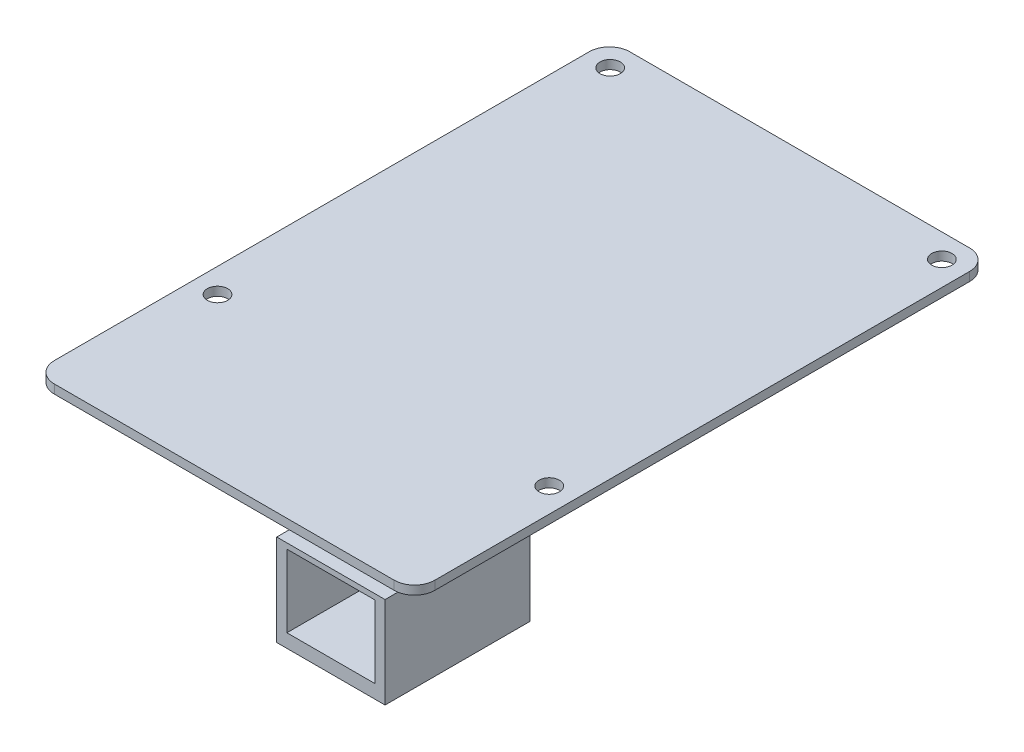
ISO-10303-21;
HEADER;
FILE_DESCRIPTION(('STEP AP214'),'2;1');
FILE_NAME('part.step','',(''),(''),'','','');
FILE_SCHEMA(('AUTOMOTIVE_DESIGN { 1 0 10303 214 1 1 1 1 }'));
ENDSEC;
DATA;
#1=APPLICATION_CONTEXT('core data for automotive mechanical design processes');
#2=APPLICATION_PROTOCOL_DEFINITION('international standard','automotive_design',2000,#1);
#3=PRODUCT_CONTEXT('',#1,'mechanical');
#4=PRODUCT('Part','Part','',(#3));
#5=PRODUCT_RELATED_PRODUCT_CATEGORY('part','',(#4));
#6=PRODUCT_DEFINITION_FORMATION('','',#4);
#7=PRODUCT_DEFINITION_CONTEXT('part definition',#1,'design');
#8=PRODUCT_DEFINITION('design','',#6,#7);
#9=PRODUCT_DEFINITION_SHAPE('','',#8);
#10=(LENGTH_UNIT() NAMED_UNIT(*) SI_UNIT(.MILLI.,.METRE.));
#11=(NAMED_UNIT(*) PLANE_ANGLE_UNIT() SI_UNIT($,.RADIAN.));
#12=(NAMED_UNIT(*) SI_UNIT($,.STERADIAN.) SOLID_ANGLE_UNIT());
#13=UNCERTAINTY_MEASURE_WITH_UNIT(LENGTH_MEASURE(1.E-05),#10,'distance_accuracy_value','');
#14=(GEOMETRIC_REPRESENTATION_CONTEXT(3) GLOBAL_UNCERTAINTY_ASSIGNED_CONTEXT((#13)) GLOBAL_UNIT_ASSIGNED_CONTEXT((#10,
#11,#12)) REPRESENTATION_CONTEXT('',''));
#15=CARTESIAN_POINT('',(0.,0.,0.));
#16=DIRECTION('',(0.,0.,1.));
#17=DIRECTION('',(1.,0.,0.));
#18=AXIS2_PLACEMENT_3D('',#15,#16,#17);
#19=CARTESIAN_POINT('',(0.,0.,0.));
#20=DIRECTION('',(0.,1.,0.));
#21=DIRECTION('',(0.,0.,1.));
#22=AXIS2_PLACEMENT_3D('',#19,#20,#21);
#23=PLANE('',#22);
#24=CARTESIAN_POINT('',(24.5,0.,19.));
#25=DIRECTION('',(0.,1.,0.));
#26=DIRECTION('',(0.,0.,1.));
#27=AXIS2_PLACEMENT_3D('',#24,#25,#26);
#28=CIRCLE('',#27,1.5);
#29=CARTESIAN_POINT('',(24.5,0.,20.5));
#30=VERTEX_POINT('',#29);
#31=EDGE_CURVE('E249',#30,#30,#28,.T.);
#32=ORIENTED_EDGE('',*,*,#31,.T.);
#33=EDGE_LOOP('',(#32));
#34=FACE_BOUND('',#33,.T.);
#35=CARTESIAN_POINT('',(24.5,0.,-39.));
#36=DIRECTION('',(0.,1.,0.));
#37=DIRECTION('',(0.,0.,1.));
#38=AXIS2_PLACEMENT_3D('',#35,#36,#37);
#39=CIRCLE('',#38,1.5);
#40=CARTESIAN_POINT('',(24.5,0.,-37.5));
#41=VERTEX_POINT('',#40);
#42=EDGE_CURVE('E307',#41,#41,#39,.T.);
#43=ORIENTED_EDGE('',*,*,#42,.T.);
#44=EDGE_LOOP('',(#43));
#45=FACE_BOUND('',#44,.T.);
#46=CARTESIAN_POINT('',(-24.5,0.,-39.));
#47=DIRECTION('',(0.,1.,0.));
#48=DIRECTION('',(0.,0.,1.));
#49=AXIS2_PLACEMENT_3D('',#46,#47,#48);
#50=CIRCLE('',#49,1.5);
#51=CARTESIAN_POINT('',(-24.5,0.,-37.5));
#52=VERTEX_POINT('',#51);
#53=EDGE_CURVE('E304',#52,#52,#50,.T.);
#54=ORIENTED_EDGE('',*,*,#53,.T.);
#55=EDGE_LOOP('',(#54));
#56=FACE_BOUND('',#55,.T.);
#57=CARTESIAN_POINT('',(-24.5,0.,19.));
#58=DIRECTION('',(0.,1.,0.));
#59=DIRECTION('',(0.,0.,1.));
#60=AXIS2_PLACEMENT_3D('',#57,#58,#59);
#61=CIRCLE('',#60,1.5);
#62=CARTESIAN_POINT('',(-24.5,0.,20.5));
#63=VERTEX_POINT('',#62);
#64=EDGE_CURVE('E241',#63,#63,#61,.T.);
#65=ORIENTED_EDGE('',*,*,#64,.T.);
#66=EDGE_LOOP('',(#65));
#67=FACE_BOUND('',#66,.T.);
#68=DIRECTION('',(0.,0.,-1.));
#69=VECTOR('',#68,1.);
#70=CARTESIAN_POINT('',(9.5999999999999,0.,44.35));
#71=LINE('',#70,#69);
#72=CARTESIAN_POINT('',(9.5999999999999,0.,42.5));
#73=VERTEX_POINT('',#72);
#74=CARTESIAN_POINT('',(9.5999999999999,0.,22.95));
#75=VERTEX_POINT('',#74);
#76=EDGE_CURVE('E11',#73,#75,#71,.T.);
#77=ORIENTED_EDGE('',*,*,#76,.F.);
#78=DIRECTION('',(1.,0.,0.));
#79=VECTOR('',#78,1.);
#80=CARTESIAN_POINT('',(-25.1,0.,42.5));
#81=LINE('',#80,#79);
#82=CARTESIAN_POINT('',(-25.1,0.,42.5));
#83=VERTEX_POINT('',#82);
#84=EDGE_CURVE('E262',#83,#73,#81,.T.);
#85=ORIENTED_EDGE('',*,*,#84,.F.);
#86=CARTESIAN_POINT('',(-25.1,0.,39.5));
#87=DIRECTION('',(0.,1.,0.));
#88=DIRECTION('',(0.,0.,1.));
#89=AXIS2_PLACEMENT_3D('',#86,#87,#88);
#90=CIRCLE('',#89,2.99999999999999);
#91=CARTESIAN_POINT('',(-28.1,0.,39.5));
#92=VERTEX_POINT('',#91);
#93=EDGE_CURVE('E267',#92,#83,#90,.T.);
#94=ORIENTED_EDGE('',*,*,#93,.F.);
#95=DIRECTION('',(0.,0.,1.));
#96=VECTOR('',#95,1.);
#97=CARTESIAN_POINT('',(-28.1,0.,-39.5));
#98=LINE('',#97,#96);
#99=CARTESIAN_POINT('',(-28.1,0.,-39.5));
#100=VERTEX_POINT('',#99);
#101=EDGE_CURVE('E271',#100,#92,#98,.T.);
#102=ORIENTED_EDGE('',*,*,#101,.F.);
#103=CARTESIAN_POINT('',(-25.1,0.,-39.5));
#104=DIRECTION('',(0.,1.,0.));
#105=DIRECTION('',(0.,0.,1.));
#106=AXIS2_PLACEMENT_3D('',#103,#104,#105);
#107=CIRCLE('',#106,2.99999999999998);
#108=CARTESIAN_POINT('',(-25.1,0.,-42.5));
#109=VERTEX_POINT('',#108);
#110=EDGE_CURVE('E40',#109,#100,#107,.T.);
#111=ORIENTED_EDGE('',*,*,#110,.F.);
#112=DIRECTION('',(-1.,0.,0.));
#113=VECTOR('',#112,1.);
#114=CARTESIAN_POINT('',(25.1,0.,-42.5));
#115=LINE('',#114,#113);
#116=CARTESIAN_POINT('',(25.1,0.,-42.5));
#117=VERTEX_POINT('',#116);
#118=EDGE_CURVE('E224',#117,#109,#115,.T.);
#119=ORIENTED_EDGE('',*,*,#118,.F.);
#120=CARTESIAN_POINT('',(25.1,0.,-39.5));
#121=DIRECTION('',(0.,1.,0.));
#122=DIRECTION('',(0.,0.,1.));
#123=AXIS2_PLACEMENT_3D('',#120,#121,#122);
#124=CIRCLE('',#123,2.99999999999999);
#125=CARTESIAN_POINT('',(28.1,0.,-39.5));
#126=VERTEX_POINT('',#125);
#127=EDGE_CURVE('E246',#126,#117,#124,.T.);
#128=ORIENTED_EDGE('',*,*,#127,.F.);
#129=DIRECTION('',(0.,0.,-1.));
#130=VECTOR('',#129,1.);
#131=CARTESIAN_POINT('',(28.1,0.,39.5));
#132=LINE('',#131,#130);
#133=CARTESIAN_POINT('',(28.1,0.,39.5));
#134=VERTEX_POINT('',#133);
#135=EDGE_CURVE('E253',#134,#126,#132,.T.);
#136=ORIENTED_EDGE('',*,*,#135,.F.);
#137=CARTESIAN_POINT('',(25.1,0.,39.5));
#138=DIRECTION('',(0.,1.,0.));
#139=DIRECTION('',(0.,0.,1.));
#140=AXIS2_PLACEMENT_3D('',#137,#138,#139);
#141=CIRCLE('',#140,2.99999999999999);
#142=CARTESIAN_POINT('',(25.5999999999999,0.,42.4580398915498));
#143=VERTEX_POINT('',#142);
#144=EDGE_CURVE('E261',#143,#134,#141,.T.);
#145=ORIENTED_EDGE('',*,*,#144,.F.);
#146=DIRECTION('',(0.,0.,1.));
#147=VECTOR('',#146,1.);
#148=CARTESIAN_POINT('',(25.5999999999999,0.,22.95));
#149=LINE('',#148,#147);
#150=CARTESIAN_POINT('',(25.5999999999999,0.,22.95));
#151=VERTEX_POINT('',#150);
#152=EDGE_CURVE('E209',#151,#143,#149,.T.);
#153=ORIENTED_EDGE('',*,*,#152,.F.);
#154=DIRECTION('',(1.,0.,0.));
#155=VECTOR('',#154,1.);
#156=CARTESIAN_POINT('',(9.5999999999999,0.,22.95));
#157=LINE('',#156,#155);
#158=EDGE_CURVE('E62',#75,#151,#157,.T.);
#159=ORIENTED_EDGE('',*,*,#158,.F.);
#160=EDGE_LOOP('',(#77,#85,#94,#102,#111,#119,#128,#136,#145,#153,#159));
#161=FACE_BOUND('',#160,.T.);
#162=ADVANCED_FACE('F37',(#34,#45,#56,#67,#161),#23,.F.);
#163=CARTESIAN_POINT('',(25.1,0.,-42.5));
#164=DIRECTION('',(0.,0.,-1.));
#165=DIRECTION('',(-1.,0.,0.));
#166=AXIS2_PLACEMENT_3D('',#163,#164,#165);
#167=PLANE('',#166);
#168=DIRECTION('',(1.,0.,0.));
#169=VECTOR('',#168,1.);
#170=CARTESIAN_POINT('',(0.,1.3,-42.5));
#171=LINE('',#170,#169);
#172=CARTESIAN_POINT('',(25.1,1.3,-42.5));
#173=VERTEX_POINT('',#172);
#174=CARTESIAN_POINT('',(-25.1,1.3,-42.5));
#175=VERTEX_POINT('',#174);
#176=EDGE_CURVE('E238',#173,#175,#171,.F.);
#177=ORIENTED_EDGE('',*,*,#176,.F.);
#178=DIRECTION('',(0.,1.,0.));
#179=VECTOR('',#178,1.);
#180=CARTESIAN_POINT('',(25.1,0.,-42.5));
#181=LINE('',#180,#179);
#182=EDGE_CURVE('E242',#117,#173,#181,.T.);
#183=ORIENTED_EDGE('',*,*,#182,.F.);
#184=ORIENTED_EDGE('',*,*,#118,.T.);
#185=DIRECTION('',(0.,1.,0.));
#186=VECTOR('',#185,1.);
#187=CARTESIAN_POINT('',(-25.1,0.,-42.5));
#188=LINE('',#187,#186);
#189=EDGE_CURVE('E272',#175,#109,#188,.F.);
#190=ORIENTED_EDGE('',*,*,#189,.F.);
#191=EDGE_LOOP('',(#177,#183,#184,#190));
#192=FACE_BOUND('',#191,.T.);
#193=ADVANCED_FACE('F334',(#192),#167,.T.);
#194=CARTESIAN_POINT('',(-25.1,0.,-39.5));
#195=DIRECTION('',(0.,1.,0.));
#196=DIRECTION('',(0.,0.,1.));
#197=AXIS2_PLACEMENT_3D('',#194,#195,#196);
#198=CYLINDRICAL_SURFACE('',#197,2.99999999999998);
#199=CARTESIAN_POINT('',(-25.1,1.3,-39.5));
#200=DIRECTION('',(0.,1.,0.));
#201=DIRECTION('',(0.,0.,1.));
#202=AXIS2_PLACEMENT_3D('',#199,#200,#201);
#203=CIRCLE('',#202,2.99999999999998);
#204=CARTESIAN_POINT('',(-28.1,1.3,-39.5));
#205=VERTEX_POINT('',#204);
#206=EDGE_CURVE('E237',#175,#205,#203,.T.);
#207=ORIENTED_EDGE('',*,*,#206,.F.);
#208=ORIENTED_EDGE('',*,*,#189,.T.);
#209=ORIENTED_EDGE('',*,*,#110,.T.);
#210=DIRECTION('',(0.,1.,0.));
#211=VECTOR('',#210,1.);
#212=CARTESIAN_POINT('',(-28.1,0.,-39.5));
#213=LINE('',#212,#211);
#214=EDGE_CURVE('E268',#205,#100,#213,.F.);
#215=ORIENTED_EDGE('',*,*,#214,.F.);
#216=EDGE_LOOP('',(#207,#208,#209,#215));
#217=FACE_BOUND('',#216,.T.);
#218=ADVANCED_FACE('F332',(#217),#198,.T.);
#219=CARTESIAN_POINT('',(-28.1,0.,-39.5));
#220=DIRECTION('',(-1.,0.,0.));
#221=DIRECTION('',(0.,0.,1.));
#222=AXIS2_PLACEMENT_3D('',#219,#220,#221);
#223=PLANE('',#222);
#224=DIRECTION('',(0.,0.,1.));
#225=VECTOR('',#224,1.);
#226=CARTESIAN_POINT('',(-28.1,1.3,0.));
#227=LINE('',#226,#225);
#228=CARTESIAN_POINT('',(-28.1,1.3,39.5));
#229=VERTEX_POINT('',#228);
#230=EDGE_CURVE('E234',#205,#229,#227,.T.);
#231=ORIENTED_EDGE('',*,*,#230,.F.);
#232=ORIENTED_EDGE('',*,*,#214,.T.);
#233=ORIENTED_EDGE('',*,*,#101,.T.);
#234=DIRECTION('',(0.,1.,0.));
#235=VECTOR('',#234,1.);
#236=CARTESIAN_POINT('',(-28.1,0.,39.5));
#237=LINE('',#236,#235);
#238=EDGE_CURVE('E263',#229,#92,#237,.F.);
#239=ORIENTED_EDGE('',*,*,#238,.F.);
#240=EDGE_LOOP('',(#231,#232,#233,#239));
#241=FACE_BOUND('',#240,.T.);
#242=ADVANCED_FACE('F329',(#241),#223,.T.);
#243=CARTESIAN_POINT('',(-25.1,0.,39.5));
#244=DIRECTION('',(0.,1.,0.));
#245=DIRECTION('',(0.,0.,1.));
#246=AXIS2_PLACEMENT_3D('',#243,#244,#245);
#247=CYLINDRICAL_SURFACE('',#246,2.99999999999999);
#248=CARTESIAN_POINT('',(-25.1,1.3,39.5));
#249=DIRECTION('',(0.,1.,0.));
#250=DIRECTION('',(0.,0.,1.));
#251=AXIS2_PLACEMENT_3D('',#248,#249,#250);
#252=CIRCLE('',#251,2.99999999999999);
#253=CARTESIAN_POINT('',(-25.1,1.3,42.5));
#254=VERTEX_POINT('',#253);
#255=EDGE_CURVE('E233',#229,#254,#252,.T.);
#256=ORIENTED_EDGE('',*,*,#255,.F.);
#257=ORIENTED_EDGE('',*,*,#238,.T.);
#258=ORIENTED_EDGE('',*,*,#93,.T.);
#259=DIRECTION('',(0.,1.,0.));
#260=VECTOR('',#259,1.);
#261=CARTESIAN_POINT('',(-25.1,0.,42.5));
#262=LINE('',#261,#260);
#263=EDGE_CURVE('E258',#254,#83,#262,.F.);
#264=ORIENTED_EDGE('',*,*,#263,.F.);
#265=EDGE_LOOP('',(#256,#257,#258,#264));
#266=FACE_BOUND('',#265,.T.);
#267=ADVANCED_FACE('F318',(#266),#247,.T.);
#268=CARTESIAN_POINT('',(-25.1,0.,42.5));
#269=DIRECTION('',(0.,0.,1.));
#270=DIRECTION('',(1.,0.,0.));
#271=AXIS2_PLACEMENT_3D('',#268,#269,#270);
#272=PLANE('',#271);
#273=DIRECTION('',(1.,0.,0.));
#274=VECTOR('',#273,1.);
#275=CARTESIAN_POINT('',(0.,1.3,42.5));
#276=LINE('',#275,#274);
#277=CARTESIAN_POINT('',(25.1,1.3,42.5));
#278=VERTEX_POINT('',#277);
#279=EDGE_CURVE('E230',#254,#278,#276,.T.);
#280=ORIENTED_EDGE('',*,*,#279,.F.);
#281=ORIENTED_EDGE('',*,*,#263,.T.);
#282=ORIENTED_EDGE('',*,*,#84,.T.);
#283=CARTESIAN_POINT('',(25.1,0.,42.5));
#284=VERTEX_POINT('',#283);
#285=EDGE_CURVE('E266',#73,#284,#81,.T.);
#286=ORIENTED_EDGE('',*,*,#285,.T.);
#287=DIRECTION('',(0.,1.,0.));
#288=VECTOR('',#287,1.);
#289=CARTESIAN_POINT('',(25.1,0.,42.5));
#290=LINE('',#289,#288);
#291=EDGE_CURVE('E254',#278,#284,#290,.F.);
#292=ORIENTED_EDGE('',*,*,#291,.F.);
#293=EDGE_LOOP('',(#280,#281,#282,#286,#292));
#294=FACE_BOUND('',#293,.T.);
#295=ADVANCED_FACE('F321',(#294),#272,.T.);
#296=CARTESIAN_POINT('',(25.1,0.,39.5));
#297=DIRECTION('',(0.,1.,0.));
#298=DIRECTION('',(0.,0.,1.));
#299=AXIS2_PLACEMENT_3D('',#296,#297,#298);
#300=CYLINDRICAL_SURFACE('',#299,2.99999999999999);
#301=CARTESIAN_POINT('',(25.1,1.3,39.5));
#302=DIRECTION('',(0.,1.,0.));
#303=DIRECTION('',(0.,0.,1.));
#304=AXIS2_PLACEMENT_3D('',#301,#302,#303);
#305=CIRCLE('',#304,2.99999999999999);
#306=CARTESIAN_POINT('',(28.1,1.3,39.5));
#307=VERTEX_POINT('',#306);
#308=EDGE_CURVE('E229',#278,#307,#305,.T.);
#309=ORIENTED_EDGE('',*,*,#308,.F.);
#310=ORIENTED_EDGE('',*,*,#291,.T.);
#311=EDGE_CURVE('E257',#284,#143,#141,.T.);
#312=ORIENTED_EDGE('',*,*,#311,.T.);
#313=ORIENTED_EDGE('',*,*,#144,.T.);
#314=DIRECTION('',(0.,1.,0.));
#315=VECTOR('',#314,1.);
#316=CARTESIAN_POINT('',(28.1,0.,39.5));
#317=LINE('',#316,#315);
#318=EDGE_CURVE('E250',#307,#134,#317,.F.);
#319=ORIENTED_EDGE('',*,*,#318,.F.);
#320=EDGE_LOOP('',(#309,#310,#312,#313,#319));
#321=FACE_BOUND('',#320,.T.);
#322=ADVANCED_FACE('F344',(#321),#300,.T.);
#323=CARTESIAN_POINT('',(28.1,0.,39.5));
#324=DIRECTION('',(1.,0.,0.));
#325=DIRECTION('',(0.,0.,-1.));
#326=AXIS2_PLACEMENT_3D('',#323,#324,#325);
#327=PLANE('',#326);
#328=DIRECTION('',(0.,0.,1.));
#329=VECTOR('',#328,1.);
#330=CARTESIAN_POINT('',(28.1,1.3,0.));
#331=LINE('',#330,#329);
#332=CARTESIAN_POINT('',(28.1,1.3,-39.5));
#333=VERTEX_POINT('',#332);
#334=EDGE_CURVE('E225',#307,#333,#331,.F.);
#335=ORIENTED_EDGE('',*,*,#334,.F.);
#336=ORIENTED_EDGE('',*,*,#318,.T.);
#337=ORIENTED_EDGE('',*,*,#135,.T.);
#338=DIRECTION('',(0.,1.,0.));
#339=VECTOR('',#338,1.);
#340=CARTESIAN_POINT('',(28.1,0.,-39.5));
#341=LINE('',#340,#339);
#342=EDGE_CURVE('E245',#333,#126,#341,.F.);
#343=ORIENTED_EDGE('',*,*,#342,.F.);
#344=EDGE_LOOP('',(#335,#336,#337,#343));
#345=FACE_BOUND('',#344,.T.);
#346=ADVANCED_FACE('F340',(#345),#327,.T.);
#347=CARTESIAN_POINT('',(25.1,0.,-39.5));
#348=DIRECTION('',(0.,1.,0.));
#349=DIRECTION('',(0.,0.,1.));
#350=AXIS2_PLACEMENT_3D('',#347,#348,#349);
#351=CYLINDRICAL_SURFACE('',#350,2.99999999999999);
#352=CARTESIAN_POINT('',(25.1,1.3,-39.5));
#353=DIRECTION('',(0.,1.,0.));
#354=DIRECTION('',(0.,0.,1.));
#355=AXIS2_PLACEMENT_3D('',#352,#353,#354);
#356=CIRCLE('',#355,2.99999999999999);
#357=EDGE_CURVE('E228',#333,#173,#356,.T.);
#358=ORIENTED_EDGE('',*,*,#357,.F.);
#359=ORIENTED_EDGE('',*,*,#342,.T.);
#360=ORIENTED_EDGE('',*,*,#127,.T.);
#361=ORIENTED_EDGE('',*,*,#182,.T.);
#362=EDGE_LOOP('',(#358,#359,#360,#361));
#363=FACE_BOUND('',#362,.T.);
#364=ADVANCED_FACE('F342',(#363),#351,.T.);
#365=CARTESIAN_POINT('',(24.5,0.,19.));
#366=DIRECTION('',(0.,1.,0.));
#367=DIRECTION('',(0.,0.,1.));
#368=AXIS2_PLACEMENT_3D('',#365,#366,#367);
#369=CYLINDRICAL_SURFACE('',#368,1.5);
#370=ORIENTED_EDGE('',*,*,#31,.F.);
#371=EDGE_LOOP('',(#370));
#372=FACE_BOUND('',#371,.T.);
#373=CARTESIAN_POINT('',(24.5,1.3,19.));
#374=DIRECTION('',(0.,1.,0.));
#375=DIRECTION('',(0.,0.,1.));
#376=AXIS2_PLACEMENT_3D('',#373,#374,#375);
#377=CIRCLE('',#376,1.5);
#378=CARTESIAN_POINT('',(24.5,1.3,20.5));
#379=VERTEX_POINT('',#378);
#380=EDGE_CURVE('E291',#379,#379,#377,.F.);
#381=ORIENTED_EDGE('',*,*,#380,.F.);
#382=EDGE_LOOP('',(#381));
#383=FACE_BOUND('',#382,.T.);
#384=ADVANCED_FACE('F405',(#372,#383),#369,.F.);
#385=CARTESIAN_POINT('',(24.5,0.,-39.));
#386=DIRECTION('',(0.,1.,0.));
#387=DIRECTION('',(0.,0.,1.));
#388=AXIS2_PLACEMENT_3D('',#385,#386,#387);
#389=CYLINDRICAL_SURFACE('',#388,1.5);
#390=ORIENTED_EDGE('',*,*,#42,.F.);
#391=EDGE_LOOP('',(#390));
#392=FACE_BOUND('',#391,.T.);
#393=CARTESIAN_POINT('',(24.5,1.3,-39.));
#394=DIRECTION('',(0.,1.,0.));
#395=DIRECTION('',(0.,0.,1.));
#396=AXIS2_PLACEMENT_3D('',#393,#394,#395);
#397=CIRCLE('',#396,1.5);
#398=CARTESIAN_POINT('',(24.5,1.3,-37.5));
#399=VERTEX_POINT('',#398);
#400=EDGE_CURVE('E288',#399,#399,#397,.F.);
#401=ORIENTED_EDGE('',*,*,#400,.F.);
#402=EDGE_LOOP('',(#401));
#403=FACE_BOUND('',#402,.T.);
#404=ADVANCED_FACE('F401',(#392,#403),#389,.F.);
#405=CARTESIAN_POINT('',(-24.5,0.,-39.));
#406=DIRECTION('',(0.,1.,0.));
#407=DIRECTION('',(0.,0.,1.));
#408=AXIS2_PLACEMENT_3D('',#405,#406,#407);
#409=CYLINDRICAL_SURFACE('',#408,1.5);
#410=ORIENTED_EDGE('',*,*,#53,.F.);
#411=EDGE_LOOP('',(#410));
#412=FACE_BOUND('',#411,.T.);
#413=CARTESIAN_POINT('',(-24.5,1.3,-39.));
#414=DIRECTION('',(0.,1.,0.));
#415=DIRECTION('',(0.,0.,1.));
#416=AXIS2_PLACEMENT_3D('',#413,#414,#415);
#417=CIRCLE('',#416,1.5);
#418=CARTESIAN_POINT('',(-24.5,1.3,-37.5));
#419=VERTEX_POINT('',#418);
#420=EDGE_CURVE('E285',#419,#419,#417,.F.);
#421=ORIENTED_EDGE('',*,*,#420,.F.);
#422=EDGE_LOOP('',(#421));
#423=FACE_BOUND('',#422,.T.);
#424=ADVANCED_FACE('F393',(#412,#423),#409,.F.);
#425=CARTESIAN_POINT('',(-24.5,0.,19.));
#426=DIRECTION('',(0.,1.,0.));
#427=DIRECTION('',(0.,0.,1.));
#428=AXIS2_PLACEMENT_3D('',#425,#426,#427);
#429=CYLINDRICAL_SURFACE('',#428,1.5);
#430=ORIENTED_EDGE('',*,*,#64,.F.);
#431=EDGE_LOOP('',(#430));
#432=FACE_BOUND('',#431,.T.);
#433=CARTESIAN_POINT('',(-24.5,1.3,19.));
#434=DIRECTION('',(0.,1.,0.));
#435=DIRECTION('',(0.,0.,1.));
#436=AXIS2_PLACEMENT_3D('',#433,#434,#435);
#437=CIRCLE('',#436,1.5);
#438=CARTESIAN_POINT('',(-24.5,1.3,20.5));
#439=VERTEX_POINT('',#438);
#440=EDGE_CURVE('E45',#439,#439,#437,.F.);
#441=ORIENTED_EDGE('',*,*,#440,.F.);
#442=EDGE_LOOP('',(#441));
#443=FACE_BOUND('',#442,.T.);
#444=ADVANCED_FACE('F385',(#432,#443),#429,.F.);
#445=CARTESIAN_POINT('',(0.,1.3,0.));
#446=DIRECTION('',(0.,1.,0.));
#447=DIRECTION('',(0.,0.,1.));
#448=AXIS2_PLACEMENT_3D('',#445,#446,#447);
#449=PLANE('',#448);
#450=ORIENTED_EDGE('',*,*,#440,.T.);
#451=EDGE_LOOP('',(#450));
#452=FACE_BOUND('',#451,.T.);
#453=ORIENTED_EDGE('',*,*,#420,.T.);
#454=EDGE_LOOP('',(#453));
#455=FACE_BOUND('',#454,.T.);
#456=ORIENTED_EDGE('',*,*,#400,.T.);
#457=EDGE_LOOP('',(#456));
#458=FACE_BOUND('',#457,.T.);
#459=ORIENTED_EDGE('',*,*,#380,.T.);
#460=EDGE_LOOP('',(#459));
#461=FACE_BOUND('',#460,.T.);
#462=ORIENTED_EDGE('',*,*,#334,.T.);
#463=ORIENTED_EDGE('',*,*,#357,.T.);
#464=ORIENTED_EDGE('',*,*,#176,.T.);
#465=ORIENTED_EDGE('',*,*,#206,.T.);
#466=ORIENTED_EDGE('',*,*,#230,.T.);
#467=ORIENTED_EDGE('',*,*,#255,.T.);
#468=ORIENTED_EDGE('',*,*,#279,.T.);
#469=ORIENTED_EDGE('',*,*,#308,.T.);
#470=EDGE_LOOP('',(#462,#463,#464,#465,#466,#467,#468,#469));
#471=FACE_BOUND('',#470,.T.);
#472=ADVANCED_FACE('F325',(#452,#455,#458,#461,#471),#449,.T.);
#473=CARTESIAN_POINT('',(9.5999999999999,-13.5,44.35));
#474=DIRECTION('',(1.,0.,0.));
#475=DIRECTION('',(0.,0.,-1.));
#476=AXIS2_PLACEMENT_3D('',#473,#474,#475);
#477=PLANE('',#476);
#478=CARTESIAN_POINT('',(9.5999999999999,0.,44.35));
#479=VERTEX_POINT('',#478);
#480=EDGE_CURVE('E47',#479,#73,#71,.T.);
#481=ORIENTED_EDGE('',*,*,#480,.T.);
#482=ORIENTED_EDGE('',*,*,#76,.T.);
#483=DIRECTION('',(0.,1.,0.));
#484=VECTOR('',#483,1.);
#485=CARTESIAN_POINT('',(9.5999999999999,-13.5,22.95));
#486=LINE('',#485,#484);
#487=CARTESIAN_POINT('',(9.5999999999999,-13.5,22.95));
#488=VERTEX_POINT('',#487);
#489=EDGE_CURVE('E221',#488,#75,#486,.T.);
#490=ORIENTED_EDGE('',*,*,#489,.F.);
#491=DIRECTION('',(0.,0.,-1.));
#492=VECTOR('',#491,1.);
#493=CARTESIAN_POINT('',(9.5999999999999,-13.5,44.35));
#494=LINE('',#493,#492);
#495=CARTESIAN_POINT('',(9.5999999999999,-13.5,44.35));
#496=VERTEX_POINT('',#495);
#497=EDGE_CURVE('E195',#496,#488,#494,.T.);
#498=ORIENTED_EDGE('',*,*,#497,.F.);
#499=DIRECTION('',(0.,1.,0.));
#500=VECTOR('',#499,1.);
#501=CARTESIAN_POINT('',(9.5999999999999,-13.5,44.35));
#502=LINE('',#501,#500);
#503=EDGE_CURVE('E204',#496,#479,#502,.T.);
#504=ORIENTED_EDGE('',*,*,#503,.T.);
#505=EDGE_LOOP('',(#481,#482,#490,#498,#504));
#506=FACE_BOUND('',#505,.T.);
#507=ADVANCED_FACE('F361',(#506),#477,.F.);
#508=CARTESIAN_POINT('',(9.5999999999999,-13.5,22.95));
#509=DIRECTION('',(0.,0.,1.));
#510=DIRECTION('',(1.,0.,0.));
#511=AXIS2_PLACEMENT_3D('',#508,#509,#510);
#512=PLANE('',#511);
#513=ORIENTED_EDGE('',*,*,#158,.T.);
#514=DIRECTION('',(0.,1.,0.));
#515=VECTOR('',#514,1.);
#516=CARTESIAN_POINT('',(25.5999999999999,-13.5,22.95));
#517=LINE('',#516,#515);
#518=CARTESIAN_POINT('',(25.5999999999999,-13.5,22.95));
#519=VERTEX_POINT('',#518);
#520=EDGE_CURVE('E218',#519,#151,#517,.T.);
#521=ORIENTED_EDGE('',*,*,#520,.F.);
#522=DIRECTION('',(1.,0.,0.));
#523=VECTOR('',#522,1.);
#524=CARTESIAN_POINT('',(9.5999999999999,-13.5,22.95));
#525=LINE('',#524,#523);
#526=EDGE_CURVE('E198',#488,#519,#525,.T.);
#527=ORIENTED_EDGE('',*,*,#526,.F.);
#528=ORIENTED_EDGE('',*,*,#489,.T.);
#529=EDGE_LOOP('',(#513,#521,#527,#528));
#530=FACE_BOUND('',#529,.T.);
#531=ADVANCED_FACE('F350',(#530),#512,.F.);
#532=CARTESIAN_POINT('',(25.5999999999999,-13.5,22.95));
#533=DIRECTION('',(-1.,0.,0.));
#534=DIRECTION('',(0.,0.,1.));
#535=AXIS2_PLACEMENT_3D('',#532,#533,#534);
#536=PLANE('',#535);
#537=ORIENTED_EDGE('',*,*,#152,.T.);
#538=CARTESIAN_POINT('',(25.5999999999999,0.,44.35));
#539=VERTEX_POINT('',#538);
#540=EDGE_CURVE('E208',#143,#539,#149,.T.);
#541=ORIENTED_EDGE('',*,*,#540,.T.);
#542=DIRECTION('',(0.,1.,0.));
#543=VECTOR('',#542,1.);
#544=CARTESIAN_POINT('',(25.5999999999999,-13.5,44.35));
#545=LINE('',#544,#543);
#546=CARTESIAN_POINT('',(25.5999999999999,-13.5,44.35));
#547=VERTEX_POINT('',#546);
#548=EDGE_CURVE('E215',#547,#539,#545,.T.);
#549=ORIENTED_EDGE('',*,*,#548,.F.);
#550=DIRECTION('',(0.,0.,1.));
#551=VECTOR('',#550,1.);
#552=CARTESIAN_POINT('',(25.5999999999999,-13.5,22.95));
#553=LINE('',#552,#551);
#554=EDGE_CURVE('E201',#519,#547,#553,.T.);
#555=ORIENTED_EDGE('',*,*,#554,.F.);
#556=ORIENTED_EDGE('',*,*,#520,.T.);
#557=EDGE_LOOP('',(#537,#541,#549,#555,#556));
#558=FACE_BOUND('',#557,.T.);
#559=ADVANCED_FACE('F353',(#558),#536,.F.);
#560=CARTESIAN_POINT('',(25.5999999999999,-13.5,44.35));
#561=DIRECTION('',(0.,0.,-1.));
#562=DIRECTION('',(-1.,0.,0.));
#563=AXIS2_PLACEMENT_3D('',#560,#561,#562);
#564=PLANE('',#563);
#565=DIRECTION('',(-1.,0.,0.));
#566=VECTOR('',#565,1.);
#567=CARTESIAN_POINT('',(11.0999999999999,-0.799999999999997,44.35));
#568=LINE('',#567,#566);
#569=CARTESIAN_POINT('',(24.0999999999999,-0.799999999999997,44.35));
#570=VERTEX_POINT('',#569);
#571=CARTESIAN_POINT('',(11.0999999999999,-0.799999999999997,44.35));
#572=VERTEX_POINT('',#571);
#573=EDGE_CURVE('E186',#570,#572,#568,.T.);
#574=ORIENTED_EDGE('',*,*,#573,.F.);
#575=DIRECTION('',(0.,1.,0.));
#576=VECTOR('',#575,1.);
#577=CARTESIAN_POINT('',(24.0999999999999,-0.799999999999997,44.35));
#578=LINE('',#577,#576);
#579=CARTESIAN_POINT('',(24.0999999999999,-11.5,44.35));
#580=VERTEX_POINT('',#579);
#581=EDGE_CURVE('E54',#580,#570,#578,.T.);
#582=ORIENTED_EDGE('',*,*,#581,.F.);
#583=DIRECTION('',(1.,0.,0.));
#584=VECTOR('',#583,1.);
#585=CARTESIAN_POINT('',(24.0999999999999,-11.5,44.35));
#586=LINE('',#585,#584);
#587=CARTESIAN_POINT('',(11.0999999999999,-11.5,44.35));
#588=VERTEX_POINT('',#587);
#589=EDGE_CURVE('E177',#588,#580,#586,.T.);
#590=ORIENTED_EDGE('',*,*,#589,.F.);
#591=DIRECTION('',(0.,-1.,0.));
#592=VECTOR('',#591,1.);
#593=CARTESIAN_POINT('',(11.0999999999999,-11.5,44.35));
#594=LINE('',#593,#592);
#595=EDGE_CURVE('E180',#572,#588,#594,.T.);
#596=ORIENTED_EDGE('',*,*,#595,.F.);
#597=EDGE_LOOP('',(#574,#582,#590,#596));
#598=FACE_BOUND('',#597,.T.);
#599=DIRECTION('',(-1.,0.,0.));
#600=VECTOR('',#599,1.);
#601=CARTESIAN_POINT('',(25.5999999999999,0.,44.35));
#602=LINE('',#601,#600);
#603=EDGE_CURVE('E199',#539,#479,#602,.T.);
#604=ORIENTED_EDGE('',*,*,#603,.T.);
#605=ORIENTED_EDGE('',*,*,#503,.F.);
#606=DIRECTION('',(-1.,0.,0.));
#607=VECTOR('',#606,1.);
#608=CARTESIAN_POINT('',(25.5999999999999,-13.5,44.35));
#609=LINE('',#608,#607);
#610=EDGE_CURVE('E203',#547,#496,#609,.T.);
#611=ORIENTED_EDGE('',*,*,#610,.F.);
#612=ORIENTED_EDGE('',*,*,#548,.T.);
#613=EDGE_LOOP('',(#604,#605,#611,#612));
#614=FACE_BOUND('',#613,.T.);
#615=ADVANCED_FACE('F367',(#598,#614),#564,.F.);
#616=CARTESIAN_POINT('',(0.,-13.5,0.));
#617=DIRECTION('',(0.,-1.,0.));
#618=DIRECTION('',(0.,0.,-1.));
#619=AXIS2_PLACEMENT_3D('',#616,#617,#618);
#620=PLANE('',#619);
#621=ORIENTED_EDGE('',*,*,#497,.T.);
#622=ORIENTED_EDGE('',*,*,#526,.T.);
#623=ORIENTED_EDGE('',*,*,#554,.T.);
#624=ORIENTED_EDGE('',*,*,#610,.T.);
#625=EDGE_LOOP('',(#621,#622,#623,#624));
#626=FACE_BOUND('',#625,.T.);
#627=ADVANCED_FACE('F357',(#626),#620,.T.);
#628=CARTESIAN_POINT('',(0.,0.,0.));
#629=DIRECTION('',(0.,-1.,0.));
#630=DIRECTION('',(0.,0.,-1.));
#631=AXIS2_PLACEMENT_3D('',#628,#629,#630);
#632=PLANE('',#631);
#633=ORIENTED_EDGE('',*,*,#311,.F.);
#634=ORIENTED_EDGE('',*,*,#285,.F.);
#635=ORIENTED_EDGE('',*,*,#480,.F.);
#636=ORIENTED_EDGE('',*,*,#603,.F.);
#637=ORIENTED_EDGE('',*,*,#540,.F.);
#638=EDGE_LOOP('',(#633,#634,#635,#636,#637));
#639=FACE_BOUND('',#638,.T.);
#640=ADVANCED_FACE('F365',(#639),#632,.F.);
#641=CARTESIAN_POINT('',(24.0999999999999,-0.799999999999997,30.35));
#642=DIRECTION('',(1.,0.,0.));
#643=DIRECTION('',(0.,0.,-1.));
#644=AXIS2_PLACEMENT_3D('',#641,#642,#643);
#645=PLANE('',#644);
#646=ORIENTED_EDGE('',*,*,#581,.T.);
#647=DIRECTION('',(0.,0.,1.));
#648=VECTOR('',#647,1.);
#649=CARTESIAN_POINT('',(24.0999999999999,-0.799999999999997,30.35));
#650=LINE('',#649,#648);
#651=CARTESIAN_POINT('',(24.0999999999999,-0.799999999999997,30.35));
#652=VERTEX_POINT('',#651);
#653=EDGE_CURVE('E155',#652,#570,#650,.T.);
#654=ORIENTED_EDGE('',*,*,#653,.F.);
#655=DIRECTION('',(0.,1.,0.));
#656=VECTOR('',#655,1.);
#657=CARTESIAN_POINT('',(24.0999999999999,-0.799999999999997,30.35));
#658=LINE('',#657,#656);
#659=CARTESIAN_POINT('',(24.0999999999999,-11.5,30.35));
#660=VERTEX_POINT('',#659);
#661=EDGE_CURVE('E159',#660,#652,#658,.T.);
#662=ORIENTED_EDGE('',*,*,#661,.F.);
#663=DIRECTION('',(0.,0.,1.));
#664=VECTOR('',#663,1.);
#665=CARTESIAN_POINT('',(24.0999999999999,-11.5,30.35));
#666=LINE('',#665,#664);
#667=EDGE_CURVE('E190',#660,#580,#666,.T.);
#668=ORIENTED_EDGE('',*,*,#667,.T.);
#669=EDGE_LOOP('',(#646,#654,#662,#668));
#670=FACE_BOUND('',#669,.T.);
#671=ADVANCED_FACE('F157',(#670),#645,.F.);
#672=CARTESIAN_POINT('',(24.0999999999999,-11.5,30.35));
#673=DIRECTION('',(0.,-1.,0.));
#674=DIRECTION('',(0.,0.,-1.));
#675=AXIS2_PLACEMENT_3D('',#672,#673,#674);
#676=PLANE('',#675);
#677=ORIENTED_EDGE('',*,*,#589,.T.);
#678=ORIENTED_EDGE('',*,*,#667,.F.);
#679=DIRECTION('',(1.,0.,0.));
#680=VECTOR('',#679,1.);
#681=CARTESIAN_POINT('',(24.0999999999999,-11.5,30.35));
#682=LINE('',#681,#680);
#683=CARTESIAN_POINT('',(11.0999999999999,-11.5,30.35));
#684=VERTEX_POINT('',#683);
#685=EDGE_CURVE('E165',#684,#660,#682,.T.);
#686=ORIENTED_EDGE('',*,*,#685,.F.);
#687=DIRECTION('',(0.,0.,1.));
#688=VECTOR('',#687,1.);
#689=CARTESIAN_POINT('',(11.0999999999999,-11.5,30.35));
#690=LINE('',#689,#688);
#691=EDGE_CURVE('E192',#684,#588,#690,.T.);
#692=ORIENTED_EDGE('',*,*,#691,.T.);
#693=EDGE_LOOP('',(#677,#678,#686,#692));
#694=FACE_BOUND('',#693,.T.);
#695=ADVANCED_FACE('F538',(#694),#676,.F.);
#696=CARTESIAN_POINT('',(11.0999999999999,-11.5,30.35));
#697=DIRECTION('',(-1.,0.,0.));
#698=DIRECTION('',(0.,0.,1.));
#699=AXIS2_PLACEMENT_3D('',#696,#697,#698);
#700=PLANE('',#699);
#701=ORIENTED_EDGE('',*,*,#595,.T.);
#702=ORIENTED_EDGE('',*,*,#691,.F.);
#703=DIRECTION('',(0.,-1.,0.));
#704=VECTOR('',#703,1.);
#705=CARTESIAN_POINT('',(11.0999999999999,-11.5,30.35));
#706=LINE('',#705,#704);
#707=CARTESIAN_POINT('',(11.0999999999999,-0.799999999999997,30.35));
#708=VERTEX_POINT('',#707);
#709=EDGE_CURVE('E173',#708,#684,#706,.T.);
#710=ORIENTED_EDGE('',*,*,#709,.F.);
#711=DIRECTION('',(0.,0.,1.));
#712=VECTOR('',#711,1.);
#713=CARTESIAN_POINT('',(11.0999999999999,-0.799999999999997,30.35));
#714=LINE('',#713,#712);
#715=EDGE_CURVE('E164',#708,#572,#714,.T.);
#716=ORIENTED_EDGE('',*,*,#715,.T.);
#717=EDGE_LOOP('',(#701,#702,#710,#716));
#718=FACE_BOUND('',#717,.T.);
#719=ADVANCED_FACE('F546',(#718),#700,.F.);
#720=CARTESIAN_POINT('',(11.0999999999999,-0.799999999999997,30.35));
#721=DIRECTION('',(0.,1.,0.));
#722=DIRECTION('',(-1.,0.,0.));
#723=AXIS2_PLACEMENT_3D('',#720,#721,#722);
#724=PLANE('',#723);
#725=ORIENTED_EDGE('',*,*,#573,.T.);
#726=ORIENTED_EDGE('',*,*,#715,.F.);
#727=DIRECTION('',(-1.,0.,0.));
#728=VECTOR('',#727,1.);
#729=CARTESIAN_POINT('',(11.0999999999999,-0.799999999999997,30.35));
#730=LINE('',#729,#728);
#731=EDGE_CURVE('E168',#652,#708,#730,.T.);
#732=ORIENTED_EDGE('',*,*,#731,.F.);
#733=ORIENTED_EDGE('',*,*,#653,.T.);
#734=EDGE_LOOP('',(#725,#726,#732,#733));
#735=FACE_BOUND('',#734,.T.);
#736=ADVANCED_FACE('F169',(#735),#724,.F.);
#737=CARTESIAN_POINT('',(0.,0.,30.35));
#738=DIRECTION('',(0.,0.,-1.));
#739=DIRECTION('',(-1.,0.,0.));
#740=AXIS2_PLACEMENT_3D('',#737,#738,#739);
#741=PLANE('',#740);
#742=ORIENTED_EDGE('',*,*,#661,.T.);
#743=ORIENTED_EDGE('',*,*,#731,.T.);
#744=ORIENTED_EDGE('',*,*,#709,.T.);
#745=ORIENTED_EDGE('',*,*,#685,.T.);
#746=EDGE_LOOP('',(#742,#743,#744,#745));
#747=FACE_BOUND('',#746,.T.);
#748=ADVANCED_FACE('F175',(#747),#741,.F.);
#749=CLOSED_SHELL('',(#162,#193,#218,#242,#267,#295,#322,#346,#364,#384,#404,#424,#444,#472,
#507,#531,#559,#615,#627,#640,#671,#695,#719,#736,#748));
#750=MANIFOLD_SOLID_BREP('B2',#749);
#751=ADVANCED_BREP_SHAPE_REPRESENTATION('',(#18,#750),#14);
#752=SHAPE_DEFINITION_REPRESENTATION(#9,#751);
ENDSEC;
END-ISO-10303-21;
